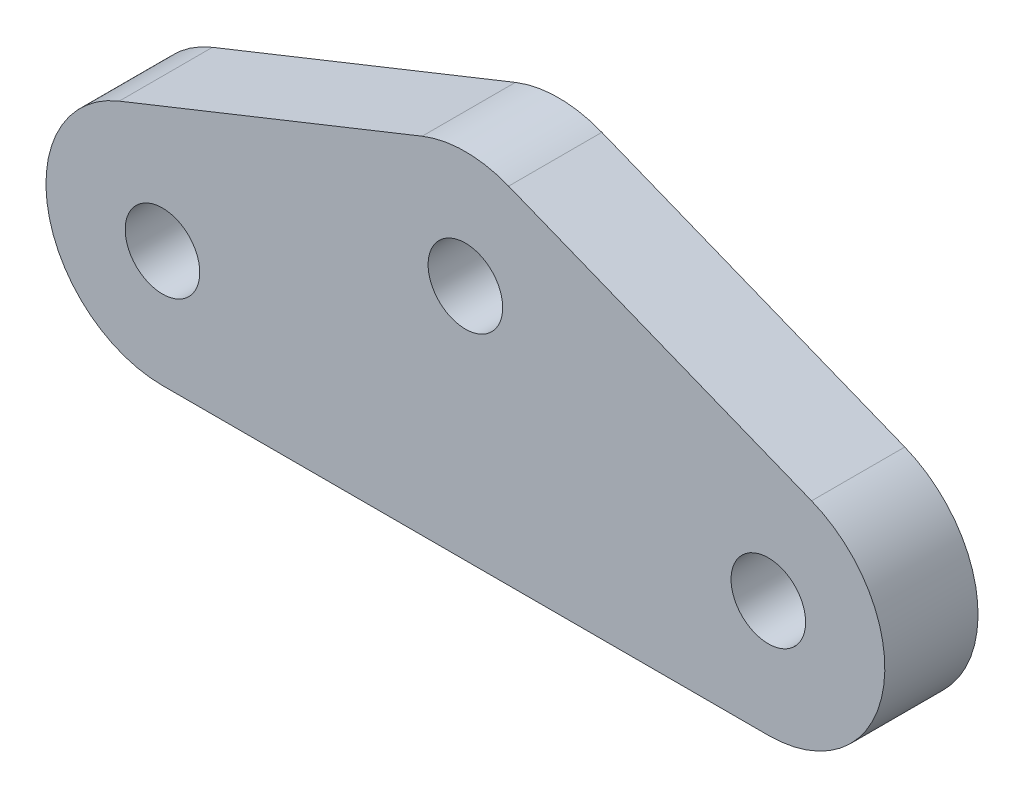
ISO-10303-21;
HEADER;
FILE_DESCRIPTION(('STEP AP214'),'2;1');
FILE_NAME('part.step','',(''),(''),'','','');
FILE_SCHEMA(('AUTOMOTIVE_DESIGN { 1 0 10303 214 1 1 1 1 }'));
ENDSEC;
DATA;
#1=APPLICATION_CONTEXT('core data for automotive mechanical design processes');
#2=APPLICATION_PROTOCOL_DEFINITION('international standard','automotive_design',2000,#1);
#3=PRODUCT_CONTEXT('',#1,'mechanical');
#4=PRODUCT('Part','Part','',(#3));
#5=PRODUCT_RELATED_PRODUCT_CATEGORY('part','',(#4));
#6=PRODUCT_DEFINITION_FORMATION('','',#4);
#7=PRODUCT_DEFINITION_CONTEXT('part definition',#1,'design');
#8=PRODUCT_DEFINITION('design','',#6,#7);
#9=PRODUCT_DEFINITION_SHAPE('','',#8);
#10=(LENGTH_UNIT() NAMED_UNIT(*) SI_UNIT(.MILLI.,.METRE.));
#11=(NAMED_UNIT(*) PLANE_ANGLE_UNIT() SI_UNIT($,.RADIAN.));
#12=(NAMED_UNIT(*) SI_UNIT($,.STERADIAN.) SOLID_ANGLE_UNIT());
#13=UNCERTAINTY_MEASURE_WITH_UNIT(LENGTH_MEASURE(1.E-05),#10,'distance_accuracy_value','');
#14=(GEOMETRIC_REPRESENTATION_CONTEXT(3) GLOBAL_UNCERTAINTY_ASSIGNED_CONTEXT((#13)) GLOBAL_UNIT_ASSIGNED_CONTEXT((#10,
#11,#12)) REPRESENTATION_CONTEXT('',''));
#15=CARTESIAN_POINT('',(0.,0.,0.));
#16=DIRECTION('',(0.,0.,1.));
#17=DIRECTION('',(1.,0.,0.));
#18=AXIS2_PLACEMENT_3D('',#15,#16,#17);
#19=CARTESIAN_POINT('',(0.,5.19615242270664,4.));
#20=DIRECTION('',(0.,0.,1.));
#21=DIRECTION('',(1.,0.,0.));
#22=AXIS2_PLACEMENT_3D('',#19,#20,#21);
#23=PLANE('',#22);
#24=CARTESIAN_POINT('',(13.,0.,4.));
#25=DIRECTION('',(0.,0.,1.));
#26=DIRECTION('',(1.,0.,0.));
#27=AXIS2_PLACEMENT_3D('',#24,#25,#26);
#28=CIRCLE('',#27,1.6);
#29=CARTESIAN_POINT('',(14.6,0.,4.));
#30=VERTEX_POINT('',#29);
#31=EDGE_CURVE('E184',#30,#30,#28,.T.);
#32=ORIENTED_EDGE('',*,*,#31,.F.);
#33=EDGE_LOOP('',(#32));
#34=FACE_BOUND('',#33,.T.);
#35=CARTESIAN_POINT('',(0.,5.19615242270664,4.));
#36=DIRECTION('',(0.,0.,1.));
#37=DIRECTION('',(1.,0.,0.));
#38=AXIS2_PLACEMENT_3D('',#35,#36,#37);
#39=CIRCLE('',#38,5.);
#40=CARTESIAN_POINT('',(1.85576872239523,9.83900956556378,4.));
#41=VERTEX_POINT('',#40);
#42=CARTESIAN_POINT('',(-1.85576872239523,9.83900956556378,4.));
#43=VERTEX_POINT('',#42);
#44=EDGE_CURVE('E129',#41,#43,#39,.T.);
#45=ORIENTED_EDGE('',*,*,#44,.T.);
#46=DIRECTION('',(-0.928571428571428,-0.371153744479046,0.));
#47=VECTOR('',#46,1.);
#48=CARTESIAN_POINT('',(-14.8557687223952,4.64285714285714,4.));
#49=LINE('',#48,#47);
#50=CARTESIAN_POINT('',(-14.8557687223952,4.64285714285714,4.));
#51=VERTEX_POINT('',#50);
#52=EDGE_CURVE('E87',#43,#51,#49,.T.);
#53=ORIENTED_EDGE('',*,*,#52,.T.);
#54=CARTESIAN_POINT('',(-13.,0.,4.));
#55=DIRECTION('',(0.,0.,1.));
#56=DIRECTION('',(1.,0.,0.));
#57=AXIS2_PLACEMENT_3D('',#54,#55,#56);
#58=CIRCLE('',#57,5.);
#59=CARTESIAN_POINT('',(-13.,-5.,4.));
#60=VERTEX_POINT('',#59);
#61=EDGE_CURVE('E100',#51,#60,#58,.T.);
#62=ORIENTED_EDGE('',*,*,#61,.T.);
#63=DIRECTION('',(1.,0.,0.));
#64=VECTOR('',#63,1.);
#65=CARTESIAN_POINT('',(13.,-5.,4.));
#66=LINE('',#65,#64);
#67=CARTESIAN_POINT('',(13.,-5.,4.));
#68=VERTEX_POINT('',#67);
#69=EDGE_CURVE('E94',#60,#68,#66,.T.);
#70=ORIENTED_EDGE('',*,*,#69,.T.);
#71=CARTESIAN_POINT('',(13.,0.,4.));
#72=DIRECTION('',(0.,0.,1.));
#73=DIRECTION('',(1.,0.,0.));
#74=AXIS2_PLACEMENT_3D('',#71,#72,#73);
#75=CIRCLE('',#74,5.);
#76=CARTESIAN_POINT('',(14.8557687223952,4.64285714285714,4.));
#77=VERTEX_POINT('',#76);
#78=EDGE_CURVE('E98',#68,#77,#75,.T.);
#79=ORIENTED_EDGE('',*,*,#78,.T.);
#80=DIRECTION('',(-0.928571428571428,0.371153744479045,0.));
#81=VECTOR('',#80,1.);
#82=CARTESIAN_POINT('',(1.85576872239523,9.83900956556378,4.));
#83=LINE('',#82,#81);
#84=EDGE_CURVE('E50',#77,#41,#83,.T.);
#85=ORIENTED_EDGE('',*,*,#84,.T.);
#86=EDGE_LOOP('',(#45,#53,#62,#70,#79,#85));
#87=FACE_BOUND('',#86,.T.);
#88=CARTESIAN_POINT('',(0.,5.19615242270664,4.));
#89=DIRECTION('',(0.,0.,1.));
#90=DIRECTION('',(1.,0.,0.));
#91=AXIS2_PLACEMENT_3D('',#88,#89,#90);
#92=CIRCLE('',#91,1.6);
#93=CARTESIAN_POINT('',(1.6,5.19615242270664,4.));
#94=VERTEX_POINT('',#93);
#95=EDGE_CURVE('E122',#94,#94,#92,.T.);
#96=ORIENTED_EDGE('',*,*,#95,.F.);
#97=EDGE_LOOP('',(#96));
#98=FACE_BOUND('',#97,.T.);
#99=CARTESIAN_POINT('',(-13.,0.,4.));
#100=DIRECTION('',(0.,0.,1.));
#101=DIRECTION('',(1.,0.,0.));
#102=AXIS2_PLACEMENT_3D('',#99,#100,#101);
#103=CIRCLE('',#102,1.6);
#104=CARTESIAN_POINT('',(-11.4,0.,4.));
#105=VERTEX_POINT('',#104);
#106=EDGE_CURVE('E175',#105,#105,#103,.T.);
#107=ORIENTED_EDGE('',*,*,#106,.F.);
#108=EDGE_LOOP('',(#107));
#109=FACE_BOUND('',#108,.T.);
#110=ADVANCED_FACE('F33',(#34,#87,#98,#109),#23,.T.);
#111=CARTESIAN_POINT('',(0.,5.19615242270664,0.));
#112=DIRECTION('',(0.,0.,1.));
#113=DIRECTION('',(1.,0.,0.));
#114=AXIS2_PLACEMENT_3D('',#111,#112,#113);
#115=PLANE('',#114);
#116=CARTESIAN_POINT('',(0.,5.19615242270664,0.));
#117=DIRECTION('',(0.,0.,1.));
#118=DIRECTION('',(1.,0.,0.));
#119=AXIS2_PLACEMENT_3D('',#116,#117,#118);
#120=CIRCLE('',#119,5.);
#121=CARTESIAN_POINT('',(1.85576872239523,9.83900956556378,0.));
#122=VERTEX_POINT('',#121);
#123=CARTESIAN_POINT('',(-1.85576872239523,9.83900956556378,0.));
#124=VERTEX_POINT('',#123);
#125=EDGE_CURVE('E118',#122,#124,#120,.T.);
#126=ORIENTED_EDGE('',*,*,#125,.F.);
#127=DIRECTION('',(-0.928571428571428,0.371153744479045,0.));
#128=VECTOR('',#127,1.);
#129=CARTESIAN_POINT('',(1.85576872239523,9.83900956556378,0.));
#130=LINE('',#129,#128);
#131=CARTESIAN_POINT('',(14.8557687223952,4.64285714285714,0.));
#132=VERTEX_POINT('',#131);
#133=EDGE_CURVE('E79',#132,#122,#130,.T.);
#134=ORIENTED_EDGE('',*,*,#133,.F.);
#135=CARTESIAN_POINT('',(13.,0.,0.));
#136=DIRECTION('',(0.,0.,1.));
#137=DIRECTION('',(1.,0.,0.));
#138=AXIS2_PLACEMENT_3D('',#135,#136,#137);
#139=CIRCLE('',#138,5.);
#140=CARTESIAN_POINT('',(13.,-5.,0.));
#141=VERTEX_POINT('',#140);
#142=EDGE_CURVE('E73',#141,#132,#139,.T.);
#143=ORIENTED_EDGE('',*,*,#142,.F.);
#144=DIRECTION('',(1.,0.,0.));
#145=VECTOR('',#144,1.);
#146=CARTESIAN_POINT('',(13.,-5.,0.));
#147=LINE('',#146,#145);
#148=CARTESIAN_POINT('',(-13.,-5.,0.));
#149=VERTEX_POINT('',#148);
#150=EDGE_CURVE('E108',#149,#141,#147,.T.);
#151=ORIENTED_EDGE('',*,*,#150,.F.);
#152=CARTESIAN_POINT('',(-13.,0.,0.));
#153=DIRECTION('',(0.,0.,1.));
#154=DIRECTION('',(1.,0.,0.));
#155=AXIS2_PLACEMENT_3D('',#152,#153,#154);
#156=CIRCLE('',#155,5.);
#157=CARTESIAN_POINT('',(-14.8557687223952,4.64285714285714,0.));
#158=VERTEX_POINT('',#157);
#159=EDGE_CURVE('E124',#158,#149,#156,.T.);
#160=ORIENTED_EDGE('',*,*,#159,.F.);
#161=DIRECTION('',(-0.928571428571428,-0.371153744479046,0.));
#162=VECTOR('',#161,1.);
#163=CARTESIAN_POINT('',(-14.8557687223952,4.64285714285714,0.));
#164=LINE('',#163,#162);
#165=EDGE_CURVE('E121',#124,#158,#164,.T.);
#166=ORIENTED_EDGE('',*,*,#165,.F.);
#167=EDGE_LOOP('',(#126,#134,#143,#151,#160,#166));
#168=FACE_BOUND('',#167,.T.);
#169=CARTESIAN_POINT('',(0.,5.19615242270664,0.));
#170=DIRECTION('',(0.,0.,1.));
#171=DIRECTION('',(1.,0.,0.));
#172=AXIS2_PLACEMENT_3D('',#169,#170,#171);
#173=CIRCLE('',#172,1.6);
#174=CARTESIAN_POINT('',(1.6,5.19615242270664,0.));
#175=VERTEX_POINT('',#174);
#176=EDGE_CURVE('E187',#175,#175,#173,.T.);
#177=ORIENTED_EDGE('',*,*,#176,.T.);
#178=EDGE_LOOP('',(#177));
#179=FACE_BOUND('',#178,.T.);
#180=CARTESIAN_POINT('',(13.,0.,0.));
#181=DIRECTION('',(0.,0.,1.));
#182=DIRECTION('',(1.,0.,0.));
#183=AXIS2_PLACEMENT_3D('',#180,#181,#182);
#184=CIRCLE('',#183,1.6);
#185=CARTESIAN_POINT('',(14.6,0.,0.));
#186=VERTEX_POINT('',#185);
#187=EDGE_CURVE('E181',#186,#186,#184,.T.);
#188=ORIENTED_EDGE('',*,*,#187,.T.);
#189=EDGE_LOOP('',(#188));
#190=FACE_BOUND('',#189,.T.);
#191=CARTESIAN_POINT('',(-13.,0.,0.));
#192=DIRECTION('',(0.,0.,1.));
#193=DIRECTION('',(1.,0.,0.));
#194=AXIS2_PLACEMENT_3D('',#191,#192,#193);
#195=CIRCLE('',#194,1.6);
#196=CARTESIAN_POINT('',(-11.4,0.,0.));
#197=VERTEX_POINT('',#196);
#198=EDGE_CURVE('E178',#197,#197,#195,.T.);
#199=ORIENTED_EDGE('',*,*,#198,.T.);
#200=EDGE_LOOP('',(#199));
#201=FACE_BOUND('',#200,.T.);
#202=ADVANCED_FACE('F138',(#168,#179,#190,#201),#115,.F.);
#203=CARTESIAN_POINT('',(0.,5.19615242270664,4.));
#204=DIRECTION('',(0.,0.,-1.));
#205=DIRECTION('',(-1.,0.,0.));
#206=AXIS2_PLACEMENT_3D('',#203,#204,#205);
#207=CYLINDRICAL_SURFACE('',#206,5.);
#208=ORIENTED_EDGE('',*,*,#125,.T.);
#209=DIRECTION('',(0.,0.,-1.));
#210=VECTOR('',#209,1.);
#211=CARTESIAN_POINT('',(-1.85576872239523,9.83900956556378,4.));
#212=LINE('',#211,#210);
#213=EDGE_CURVE('E11',#43,#124,#212,.T.);
#214=ORIENTED_EDGE('',*,*,#213,.F.);
#215=ORIENTED_EDGE('',*,*,#44,.F.);
#216=DIRECTION('',(0.,0.,-1.));
#217=VECTOR('',#216,1.);
#218=CARTESIAN_POINT('',(1.85576872239523,9.83900956556378,4.));
#219=LINE('',#218,#217);
#220=EDGE_CURVE('E114',#41,#122,#219,.T.);
#221=ORIENTED_EDGE('',*,*,#220,.T.);
#222=EDGE_LOOP('',(#208,#214,#215,#221));
#223=FACE_BOUND('',#222,.T.);
#224=ADVANCED_FACE('F35',(#223),#207,.T.);
#225=CARTESIAN_POINT('',(-14.8557687223952,4.64285714285714,4.));
#226=DIRECTION('',(0.371153744479046,-0.928571428571428,0.));
#227=DIRECTION('',(0.928571428571428,0.371153744479046,0.));
#228=AXIS2_PLACEMENT_3D('',#225,#226,#227);
#229=PLANE('',#228);
#230=ORIENTED_EDGE('',*,*,#165,.T.);
#231=DIRECTION('',(0.,0.,-1.));
#232=VECTOR('',#231,1.);
#233=CARTESIAN_POINT('',(-14.8557687223952,4.64285714285714,4.));
#234=LINE('',#233,#232);
#235=EDGE_CURVE('E42',#51,#158,#234,.T.);
#236=ORIENTED_EDGE('',*,*,#235,.F.);
#237=ORIENTED_EDGE('',*,*,#52,.F.);
#238=ORIENTED_EDGE('',*,*,#213,.T.);
#239=EDGE_LOOP('',(#230,#236,#237,#238));
#240=FACE_BOUND('',#239,.T.);
#241=ADVANCED_FACE('F237',(#240),#229,.F.);
#242=CARTESIAN_POINT('',(-13.,0.,4.));
#243=DIRECTION('',(0.,0.,-1.));
#244=DIRECTION('',(-1.,0.,0.));
#245=AXIS2_PLACEMENT_3D('',#242,#243,#244);
#246=CYLINDRICAL_SURFACE('',#245,5.);
#247=ORIENTED_EDGE('',*,*,#159,.T.);
#248=DIRECTION('',(0.,0.,-1.));
#249=VECTOR('',#248,1.);
#250=CARTESIAN_POINT('',(-13.,-5.,4.));
#251=LINE('',#250,#249);
#252=EDGE_CURVE('E109',#60,#149,#251,.T.);
#253=ORIENTED_EDGE('',*,*,#252,.F.);
#254=ORIENTED_EDGE('',*,*,#61,.F.);
#255=ORIENTED_EDGE('',*,*,#235,.T.);
#256=EDGE_LOOP('',(#247,#253,#254,#255));
#257=FACE_BOUND('',#256,.T.);
#258=ADVANCED_FACE('F135',(#257),#246,.T.);
#259=CARTESIAN_POINT('',(13.,-5.,4.));
#260=DIRECTION('',(0.,1.,0.));
#261=DIRECTION('',(0.,0.,1.));
#262=AXIS2_PLACEMENT_3D('',#259,#260,#261);
#263=PLANE('',#262);
#264=ORIENTED_EDGE('',*,*,#150,.T.);
#265=DIRECTION('',(0.,0.,-1.));
#266=VECTOR('',#265,1.);
#267=CARTESIAN_POINT('',(13.,-5.,4.));
#268=LINE('',#267,#266);
#269=EDGE_CURVE('E105',#68,#141,#268,.T.);
#270=ORIENTED_EDGE('',*,*,#269,.F.);
#271=ORIENTED_EDGE('',*,*,#69,.F.);
#272=ORIENTED_EDGE('',*,*,#252,.T.);
#273=EDGE_LOOP('',(#264,#270,#271,#272));
#274=FACE_BOUND('',#273,.T.);
#275=ADVANCED_FACE('F106',(#274),#263,.F.);
#276=CARTESIAN_POINT('',(13.,0.,4.));
#277=DIRECTION('',(0.,0.,-1.));
#278=DIRECTION('',(-1.,0.,0.));
#279=AXIS2_PLACEMENT_3D('',#276,#277,#278);
#280=CYLINDRICAL_SURFACE('',#279,5.);
#281=ORIENTED_EDGE('',*,*,#142,.T.);
#282=DIRECTION('',(0.,0.,-1.));
#283=VECTOR('',#282,1.);
#284=CARTESIAN_POINT('',(14.8557687223952,4.64285714285714,4.));
#285=LINE('',#284,#283);
#286=EDGE_CURVE('E110',#77,#132,#285,.T.);
#287=ORIENTED_EDGE('',*,*,#286,.F.);
#288=ORIENTED_EDGE('',*,*,#78,.F.);
#289=ORIENTED_EDGE('',*,*,#269,.T.);
#290=EDGE_LOOP('',(#281,#287,#288,#289));
#291=FACE_BOUND('',#290,.T.);
#292=ADVANCED_FACE('F112',(#291),#280,.T.);
#293=CARTESIAN_POINT('',(1.85576872239523,9.83900956556378,4.));
#294=DIRECTION('',(-0.371153744479046,-0.928571428571429,0.));
#295=DIRECTION('',(0.928571428571429,-0.371153744479046,0.));
#296=AXIS2_PLACEMENT_3D('',#293,#294,#295);
#297=PLANE('',#296);
#298=ORIENTED_EDGE('',*,*,#133,.T.);
#299=ORIENTED_EDGE('',*,*,#220,.F.);
#300=ORIENTED_EDGE('',*,*,#84,.F.);
#301=ORIENTED_EDGE('',*,*,#286,.T.);
#302=EDGE_LOOP('',(#298,#299,#300,#301));
#303=FACE_BOUND('',#302,.T.);
#304=ADVANCED_FACE('F143',(#303),#297,.F.);
#305=CARTESIAN_POINT('',(0.,5.19615242270664,4.));
#306=DIRECTION('',(0.,0.,-1.));
#307=DIRECTION('',(-1.,0.,0.));
#308=AXIS2_PLACEMENT_3D('',#305,#306,#307);
#309=CYLINDRICAL_SURFACE('',#308,1.6);
#310=ORIENTED_EDGE('',*,*,#95,.T.);
#311=EDGE_LOOP('',(#310));
#312=FACE_BOUND('',#311,.T.);
#313=ORIENTED_EDGE('',*,*,#176,.F.);
#314=EDGE_LOOP('',(#313));
#315=FACE_BOUND('',#314,.T.);
#316=ADVANCED_FACE('F145',(#312,#315),#309,.F.);
#317=CARTESIAN_POINT('',(13.,0.,4.));
#318=DIRECTION('',(0.,0.,-1.));
#319=DIRECTION('',(-1.,0.,0.));
#320=AXIS2_PLACEMENT_3D('',#317,#318,#319);
#321=CYLINDRICAL_SURFACE('',#320,1.6);
#322=ORIENTED_EDGE('',*,*,#31,.T.);
#323=EDGE_LOOP('',(#322));
#324=FACE_BOUND('',#323,.T.);
#325=ORIENTED_EDGE('',*,*,#187,.F.);
#326=EDGE_LOOP('',(#325));
#327=FACE_BOUND('',#326,.T.);
#328=ADVANCED_FACE('F151',(#324,#327),#321,.F.);
#329=CARTESIAN_POINT('',(-13.,0.,4.));
#330=DIRECTION('',(0.,0.,-1.));
#331=DIRECTION('',(-1.,0.,0.));
#332=AXIS2_PLACEMENT_3D('',#329,#330,#331);
#333=CYLINDRICAL_SURFACE('',#332,1.6);
#334=ORIENTED_EDGE('',*,*,#106,.T.);
#335=EDGE_LOOP('',(#334));
#336=FACE_BOUND('',#335,.T.);
#337=ORIENTED_EDGE('',*,*,#198,.F.);
#338=EDGE_LOOP('',(#337));
#339=FACE_BOUND('',#338,.T.);
#340=ADVANCED_FACE('F166',(#336,#339),#333,.F.);
#341=CLOSED_SHELL('',(#110,#202,#224,#241,#258,#275,#292,#304,#316,#328,#340));
#342=MANIFOLD_SOLID_BREP('B2',#341);
#343=ADVANCED_BREP_SHAPE_REPRESENTATION('',(#18,#342),#14);
#344=SHAPE_DEFINITION_REPRESENTATION(#9,#343);
ENDSEC;
END-ISO-10303-21;
